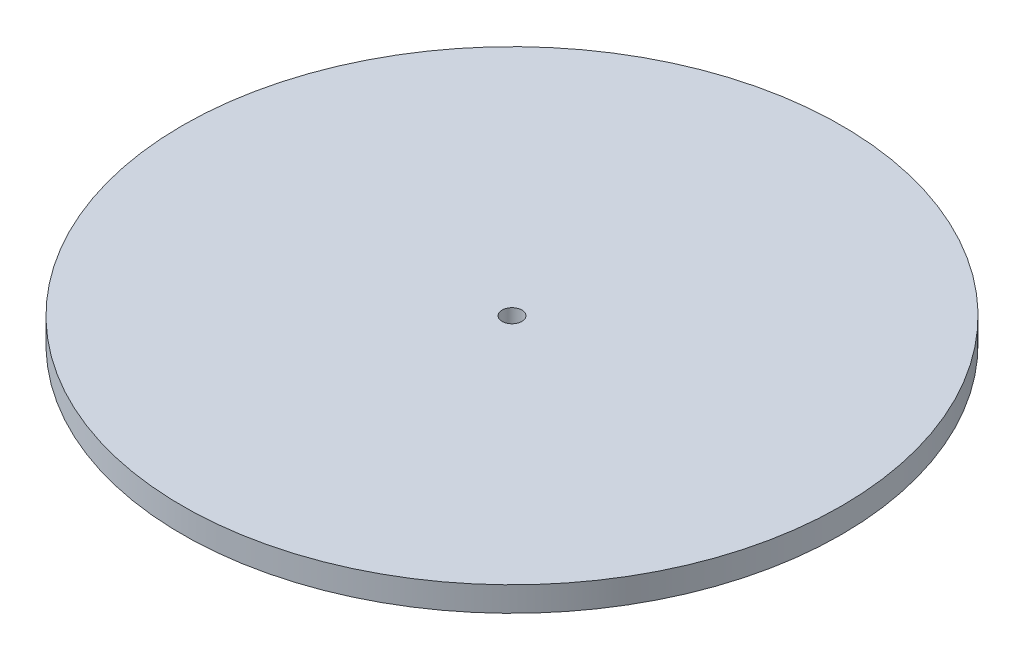
ISO-10303-21;
HEADER;
FILE_DESCRIPTION(('STEP AP214'),'2;1');
FILE_NAME('part.step','',(''),(''),'','','');
FILE_SCHEMA(('AUTOMOTIVE_DESIGN { 1 0 10303 214 1 1 1 1 }'));
ENDSEC;
DATA;
#1=APPLICATION_CONTEXT('core data for automotive mechanical design processes');
#2=APPLICATION_PROTOCOL_DEFINITION('international standard','automotive_design',2000,#1);
#3=PRODUCT_CONTEXT('',#1,'mechanical');
#4=PRODUCT('Part','Part','',(#3));
#5=PRODUCT_RELATED_PRODUCT_CATEGORY('part','',(#4));
#6=PRODUCT_DEFINITION_FORMATION('','',#4);
#7=PRODUCT_DEFINITION_CONTEXT('part definition',#1,'design');
#8=PRODUCT_DEFINITION('design','',#6,#7);
#9=PRODUCT_DEFINITION_SHAPE('','',#8);
#10=(LENGTH_UNIT() NAMED_UNIT(*) SI_UNIT(.MILLI.,.METRE.));
#11=(NAMED_UNIT(*) PLANE_ANGLE_UNIT() SI_UNIT($,.RADIAN.));
#12=(NAMED_UNIT(*) SI_UNIT($,.STERADIAN.) SOLID_ANGLE_UNIT());
#13=UNCERTAINTY_MEASURE_WITH_UNIT(LENGTH_MEASURE(1.E-05),#10,'distance_accuracy_value','');
#14=(GEOMETRIC_REPRESENTATION_CONTEXT(3) GLOBAL_UNCERTAINTY_ASSIGNED_CONTEXT((#13)) GLOBAL_UNIT_ASSIGNED_CONTEXT((#10,
#11,#12)) REPRESENTATION_CONTEXT('',''));
#15=CARTESIAN_POINT('',(0.,0.,0.));
#16=DIRECTION('',(0.,0.,1.));
#17=DIRECTION('',(1.,0.,0.));
#18=AXIS2_PLACEMENT_3D('',#15,#16,#17);
#19=CARTESIAN_POINT('',(0.,8.47527821700396,0.));
#20=DIRECTION('',(0.,1.,0.));
#21=DIRECTION('',(-1.,0.,0.));
#22=AXIS2_PLACEMENT_3D('',#19,#20,#21);
#23=CYLINDRICAL_SURFACE('',#22,40.);
#24=CARTESIAN_POINT('',(0.,8.47527821700396,0.));
#25=DIRECTION('',(0.,1.,0.));
#26=DIRECTION('',(-1.,0.,0.));
#27=AXIS2_PLACEMENT_3D('',#24,#25,#26);
#28=CIRCLE('',#27,40.);
#29=CARTESIAN_POINT('',(-40.,8.47527821700396,0.));
#30=VERTEX_POINT('',#29);
#31=EDGE_CURVE('E50',#30,#30,#28,.T.);
#32=ORIENTED_EDGE('',*,*,#31,.F.);
#33=EDGE_LOOP('',(#32));
#34=FACE_BOUND('',#33,.T.);
#35=CARTESIAN_POINT('',(0.,5.47527821700396,0.));
#36=DIRECTION('',(0.,1.,0.));
#37=DIRECTION('',(-1.,0.,0.));
#38=AXIS2_PLACEMENT_3D('',#35,#36,#37);
#39=CIRCLE('',#38,40.);
#40=CARTESIAN_POINT('',(-40.,5.47527821700396,0.));
#41=VERTEX_POINT('',#40);
#42=EDGE_CURVE('E10',#41,#41,#39,.T.);
#43=ORIENTED_EDGE('',*,*,#42,.T.);
#44=EDGE_LOOP('',(#43));
#45=FACE_BOUND('',#44,.T.);
#46=ADVANCED_FACE('F31',(#34,#45),#23,.T.);
#47=CARTESIAN_POINT('',(37.,5.47527821700396,0.));
#48=DIRECTION('',(0.,1.,0.));
#49=DIRECTION('',(-1.,0.,0.));
#50=AXIS2_PLACEMENT_3D('',#47,#48,#49);
#51=PLANE('',#50);
#52=ORIENTED_EDGE('',*,*,#42,.F.);
#53=EDGE_LOOP('',(#52));
#54=FACE_BOUND('',#53,.T.);
#55=CARTESIAN_POINT('',(0.,5.47527821700396,0.));
#56=DIRECTION('',(0.,1.,0.));
#57=DIRECTION('',(-1.,0.,0.));
#58=AXIS2_PLACEMENT_3D('',#55,#56,#57);
#59=CIRCLE('',#58,37.);
#60=CARTESIAN_POINT('',(-37.,5.47527821700396,0.));
#61=VERTEX_POINT('',#60);
#62=EDGE_CURVE('E37',#61,#61,#59,.T.);
#63=ORIENTED_EDGE('',*,*,#62,.T.);
#64=EDGE_LOOP('',(#63));
#65=FACE_BOUND('',#64,.T.);
#66=ADVANCED_FACE('F71',(#54,#65),#51,.F.);
#67=CARTESIAN_POINT('',(0.,8.47527821700396,0.));
#68=DIRECTION('',(0.,1.,0.));
#69=DIRECTION('',(-1.,0.,0.));
#70=AXIS2_PLACEMENT_3D('',#67,#68,#69);
#71=CYLINDRICAL_SURFACE('',#70,37.);
#72=ORIENTED_EDGE('',*,*,#62,.F.);
#73=EDGE_LOOP('',(#72));
#74=FACE_BOUND('',#73,.T.);
#75=CARTESIAN_POINT('',(0.,4.47527821700397,0.));
#76=DIRECTION('',(0.,1.,0.));
#77=DIRECTION('',(-1.,0.,0.));
#78=AXIS2_PLACEMENT_3D('',#75,#76,#77);
#79=CIRCLE('',#78,37.);
#80=CARTESIAN_POINT('',(-37.,4.47527821700397,0.));
#81=VERTEX_POINT('',#80);
#82=EDGE_CURVE('E41',#81,#81,#79,.T.);
#83=ORIENTED_EDGE('',*,*,#82,.T.);
#84=EDGE_LOOP('',(#83));
#85=FACE_BOUND('',#84,.T.);
#86=ADVANCED_FACE('F67',(#74,#85),#71,.T.);
#87=CARTESIAN_POINT('',(7.04059206768637E-12,0.,0.));
#88=CARTESIAN_POINT('',(4.62500000107397,0.000222748438478832,0.));
#89=CARTESIAN_POINT('',(9.25000000168959,0.236781285850993,0.));
#90=CARTESIAN_POINT('',(13.8750000018417,0.716081327629966,0.));
#91=CARTESIAN_POINT('',(18.5000000016774,1.36108971030506,0.));
#92=CARTESIAN_POINT('',(23.1250000013698,2.08108319029838,0.));
#93=CARTESIAN_POINT('',(27.7500000009512,2.85925197485835,0.));
#94=CARTESIAN_POINT('',(32.375000000488,3.66078213255325,0.));
#95=CARTESIAN_POINT('',(37.,4.47527821700397,0.));
#96=B_SPLINE_CURVE_WITH_KNOTS('',8,(#87,#88,#89,#90,#91,#92,#93,#94,#95),.UNSPECIFIED.,.F.,.F.,
(9,9),(0.0833836242082638,0.917219866478574),.UNSPECIFIED.);
#97=CARTESIAN_POINT('',(0.,8.47527821700396,0.));
#98=DIRECTION('',(0.,1.,0.));
#99=AXIS1_PLACEMENT('',#97,#98);
#100=SURFACE_OF_REVOLUTION('',#96,#99);
#101=CARTESIAN_POINT('',(0.,0.00702430840447341,0.));
#102=DIRECTION('',(0.,1.,0.));
#103=DIRECTION('',(-1.,0.,0.));
#104=AXIS2_PLACEMENT_3D('',#101,#102,#103);
#105=CIRCLE('',#104,1.20000000000053);
#106=CARTESIAN_POINT('',(-1.20000000000053,0.00702430840447341,0.));
#107=VERTEX_POINT('',#106);
#108=EDGE_CURVE('E53',#107,#107,#105,.T.);
#109=ORIENTED_EDGE('',*,*,#108,.T.);
#110=EDGE_LOOP('',(#109));
#111=FACE_BOUND('',#110,.T.);
#112=ORIENTED_EDGE('',*,*,#82,.F.);
#113=EDGE_LOOP('',(#112));
#114=FACE_BOUND('',#113,.T.);
#115=ADVANCED_FACE('F62',(#111,#114),#100,.T.);
#116=CARTESIAN_POINT('',(0.,8.47527821700396,0.));
#117=DIRECTION('',(0.,1.,0.));
#118=DIRECTION('',(-1.,0.,0.));
#119=AXIS2_PLACEMENT_3D('',#116,#117,#118);
#120=CYLINDRICAL_SURFACE('',#119,1.2);
#121=CARTESIAN_POINT('',(0.,8.47527821700396,0.));
#122=DIRECTION('',(0.,1.,0.));
#123=DIRECTION('',(-1.,0.,0.));
#124=AXIS2_PLACEMENT_3D('',#121,#122,#123);
#125=CIRCLE('',#124,1.2);
#126=CARTESIAN_POINT('',(-1.2,8.47527821700396,0.));
#127=VERTEX_POINT('',#126);
#128=EDGE_CURVE('E45',#127,#127,#125,.T.);
#129=ORIENTED_EDGE('',*,*,#128,.T.);
#130=EDGE_LOOP('',(#129));
#131=FACE_BOUND('',#130,.T.);
#132=ORIENTED_EDGE('',*,*,#108,.F.);
#133=EDGE_LOOP('',(#132));
#134=FACE_BOUND('',#133,.T.);
#135=ADVANCED_FACE('F66',(#131,#134),#120,.F.);
#136=CARTESIAN_POINT('',(40.,8.47527821700396,0.));
#137=DIRECTION('',(0.,-1.,0.));
#138=DIRECTION('',(1.,0.,0.));
#139=AXIS2_PLACEMENT_3D('',#136,#137,#138);
#140=PLANE('',#139);
#141=ORIENTED_EDGE('',*,*,#128,.F.);
#142=EDGE_LOOP('',(#141));
#143=FACE_BOUND('',#142,.T.);
#144=ORIENTED_EDGE('',*,*,#31,.T.);
#145=EDGE_LOOP('',(#144));
#146=FACE_BOUND('',#145,.T.);
#147=ADVANCED_FACE('F83',(#143,#146),#140,.F.);
#148=CLOSED_SHELL('',(#46,#66,#86,#115,#135,#147));
#149=MANIFOLD_SOLID_BREP('B2',#148);
#150=ADVANCED_BREP_SHAPE_REPRESENTATION('',(#18,#149),#14);
#151=SHAPE_DEFINITION_REPRESENTATION(#9,#150);
ENDSEC;
END-ISO-10303-21;
